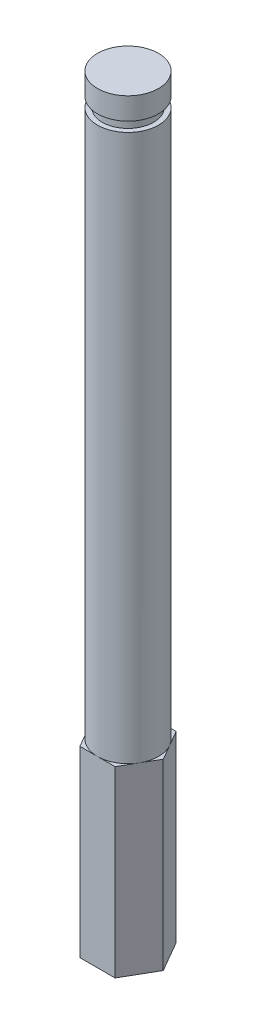
ISO-10303-21;
HEADER;
FILE_DESCRIPTION(('STEP AP214'),'2;1');
FILE_NAME('part.step','',(''),(''),'','','');
FILE_SCHEMA(('AUTOMOTIVE_DESIGN { 1 0 10303 214 1 1 1 1 }'));
ENDSEC;
DATA;
#1=APPLICATION_CONTEXT('core data for automotive mechanical design processes');
#2=APPLICATION_PROTOCOL_DEFINITION('international standard','automotive_design',2000,#1);
#3=PRODUCT_CONTEXT('',#1,'mechanical');
#4=PRODUCT('Part','Part','',(#3));
#5=PRODUCT_RELATED_PRODUCT_CATEGORY('part','',(#4));
#6=PRODUCT_DEFINITION_FORMATION('','',#4);
#7=PRODUCT_DEFINITION_CONTEXT('part definition',#1,'design');
#8=PRODUCT_DEFINITION('design','',#6,#7);
#9=PRODUCT_DEFINITION_SHAPE('','',#8);
#10=(LENGTH_UNIT() NAMED_UNIT(*) SI_UNIT(.MILLI.,.METRE.));
#11=(NAMED_UNIT(*) PLANE_ANGLE_UNIT() SI_UNIT($,.RADIAN.));
#12=(NAMED_UNIT(*) SI_UNIT($,.STERADIAN.) SOLID_ANGLE_UNIT());
#13=UNCERTAINTY_MEASURE_WITH_UNIT(LENGTH_MEASURE(1.E-05),#10,'distance_accuracy_value','');
#14=(GEOMETRIC_REPRESENTATION_CONTEXT(3) GLOBAL_UNCERTAINTY_ASSIGNED_CONTEXT((#13)) GLOBAL_UNIT_ASSIGNED_CONTEXT((#10,
#11,#12)) REPRESENTATION_CONTEXT('',''));
#15=CARTESIAN_POINT('',(0.,0.,0.));
#16=DIRECTION('',(0.,0.,1.));
#17=DIRECTION('',(1.,0.,0.));
#18=AXIS2_PLACEMENT_3D('',#15,#16,#17);
#19=CARTESIAN_POINT('',(0.,19.05,0.));
#20=DIRECTION('',(0.,1.,0.));
#21=DIRECTION('',(0.,0.,1.));
#22=AXIS2_PLACEMENT_3D('',#19,#20,#21);
#23=PLANE('',#22);
#24=CARTESIAN_POINT('',(0.,19.05,0.));
#25=DIRECTION('',(0.,1.,0.));
#26=DIRECTION('',(0.,0.,1.));
#27=AXIS2_PLACEMENT_3D('',#24,#25,#26);
#28=CIRCLE('',#27,3.175);
#29=CARTESIAN_POINT('',(0.,19.05,3.175));
#30=VERTEX_POINT('',#29);
#31=CARTESIAN_POINT('',(2.74963065701559,19.05,1.5875));
#32=VERTEX_POINT('',#31);
#33=EDGE_CURVE('E134',#30,#32,#28,.T.);
#34=ORIENTED_EDGE('',*,*,#33,.F.);
#35=DIRECTION('',(1.,0.,0.));
#36=VECTOR('',#35,1.);
#37=CARTESIAN_POINT('',(-1.83308710467706,19.05,3.175));
#38=LINE('',#37,#36);
#39=CARTESIAN_POINT('',(1.83308710467706,19.05,3.175));
#40=VERTEX_POINT('',#39);
#41=EDGE_CURVE('E122',#30,#40,#38,.T.);
#42=ORIENTED_EDGE('',*,*,#41,.T.);
#43=DIRECTION('',(0.5,0.,-0.866025403784438));
#44=VECTOR('',#43,1.);
#45=CARTESIAN_POINT('',(1.83308710467706,19.05,3.175));
#46=LINE('',#45,#44);
#47=EDGE_CURVE('E135',#40,#32,#46,.T.);
#48=ORIENTED_EDGE('',*,*,#47,.T.);
#49=EDGE_LOOP('',(#34,#42,#48));
#50=FACE_BOUND('',#49,.T.);
#51=ADVANCED_FACE('F43',(#50),#23,.T.);
#52=CARTESIAN_POINT('',(2.74963065701559,19.05,-1.5875));
#53=VERTEX_POINT('',#52);
#54=EDGE_CURVE('E52',#32,#53,#28,.T.);
#55=ORIENTED_EDGE('',*,*,#54,.F.);
#56=CARTESIAN_POINT('',(3.66617420935412,19.05,0.));
#57=VERTEX_POINT('',#56);
#58=EDGE_CURVE('E121',#32,#57,#46,.T.);
#59=ORIENTED_EDGE('',*,*,#58,.T.);
#60=DIRECTION('',(-0.5,0.,-0.866025403784438));
#61=VECTOR('',#60,1.);
#62=CARTESIAN_POINT('',(3.66617420935412,19.05,0.));
#63=LINE('',#62,#61);
#64=EDGE_CURVE('E149',#57,#53,#63,.T.);
#65=ORIENTED_EDGE('',*,*,#64,.T.);
#66=EDGE_LOOP('',(#55,#59,#65));
#67=FACE_BOUND('',#66,.T.);
#68=ADVANCED_FACE('F210',(#67),#23,.T.);
#69=CARTESIAN_POINT('',(0.,19.05,-3.175));
#70=VERTEX_POINT('',#69);
#71=EDGE_CURVE('E212',#53,#70,#28,.T.);
#72=ORIENTED_EDGE('',*,*,#71,.F.);
#73=CARTESIAN_POINT('',(1.83308710467706,19.05,-3.175));
#74=VERTEX_POINT('',#73);
#75=EDGE_CURVE('E152',#53,#74,#63,.T.);
#76=ORIENTED_EDGE('',*,*,#75,.T.);
#77=DIRECTION('',(-1.,0.,0.));
#78=VECTOR('',#77,1.);
#79=CARTESIAN_POINT('',(1.83308710467706,19.05,-3.175));
#80=LINE('',#79,#78);
#81=EDGE_CURVE('E153',#74,#70,#80,.T.);
#82=ORIENTED_EDGE('',*,*,#81,.T.);
#83=EDGE_LOOP('',(#72,#76,#82));
#84=FACE_BOUND('',#83,.T.);
#85=ADVANCED_FACE('F218',(#84),#23,.T.);
#86=CARTESIAN_POINT('',(-2.74963065701559,19.05,-1.5875));
#87=VERTEX_POINT('',#86);
#88=EDGE_CURVE('E144',#70,#87,#28,.T.);
#89=ORIENTED_EDGE('',*,*,#88,.F.);
#90=CARTESIAN_POINT('',(-1.83308710467706,19.05,-3.175));
#91=VERTEX_POINT('',#90);
#92=EDGE_CURVE('E151',#70,#91,#80,.T.);
#93=ORIENTED_EDGE('',*,*,#92,.T.);
#94=DIRECTION('',(-0.5,0.,0.866025403784438));
#95=VECTOR('',#94,1.);
#96=CARTESIAN_POINT('',(-1.83308710467706,19.05,-3.175));
#97=LINE('',#96,#95);
#98=EDGE_CURVE('E157',#91,#87,#97,.T.);
#99=ORIENTED_EDGE('',*,*,#98,.T.);
#100=EDGE_LOOP('',(#89,#93,#99));
#101=FACE_BOUND('',#100,.T.);
#102=ADVANCED_FACE('F214',(#101),#23,.T.);
#103=CARTESIAN_POINT('',(-2.74963065701559,19.05,1.5875));
#104=VERTEX_POINT('',#103);
#105=EDGE_CURVE('E143',#87,#104,#28,.T.);
#106=ORIENTED_EDGE('',*,*,#105,.F.);
#107=CARTESIAN_POINT('',(-3.66617420935413,19.05,0.));
#108=VERTEX_POINT('',#107);
#109=EDGE_CURVE('E156',#87,#108,#97,.T.);
#110=ORIENTED_EDGE('',*,*,#109,.T.);
#111=DIRECTION('',(0.5,0.,0.866025403784438));
#112=VECTOR('',#111,1.);
#113=CARTESIAN_POINT('',(-3.66617420935413,19.05,0.));
#114=LINE('',#113,#112);
#115=EDGE_CURVE('E132',#108,#104,#114,.T.);
#116=ORIENTED_EDGE('',*,*,#115,.T.);
#117=EDGE_LOOP('',(#106,#110,#116));
#118=FACE_BOUND('',#117,.T.);
#119=ADVANCED_FACE('F225',(#118),#23,.T.);
#120=CARTESIAN_POINT('',(3.66617420935412,19.05,0.));
#121=DIRECTION('',(-0.866025403784439,0.,0.5));
#122=DIRECTION('',(0.5,0.,0.866025403784438));
#123=AXIS2_PLACEMENT_3D('',#120,#121,#122);
#124=PLANE('',#123);
#125=DIRECTION('',(-0.5,0.,-0.866025403784438));
#126=VECTOR('',#125,1.);
#127=CARTESIAN_POINT('',(3.66617420935412,0.,0.));
#128=LINE('',#127,#126);
#129=CARTESIAN_POINT('',(3.66617420935412,0.,0.));
#130=VERTEX_POINT('',#129);
#131=CARTESIAN_POINT('',(1.83308710467706,0.,-3.175));
#132=VERTEX_POINT('',#131);
#133=EDGE_CURVE('E164',#130,#132,#128,.T.);
#134=ORIENTED_EDGE('',*,*,#133,.T.);
#135=DIRECTION('',(0.,-1.,0.));
#136=VECTOR('',#135,1.);
#137=CARTESIAN_POINT('',(1.83308710467706,19.05,-3.175));
#138=LINE('',#137,#136);
#139=EDGE_CURVE('E47',#74,#132,#138,.T.);
#140=ORIENTED_EDGE('',*,*,#139,.F.);
#141=ORIENTED_EDGE('',*,*,#75,.F.);
#142=ORIENTED_EDGE('',*,*,#64,.F.);
#143=DIRECTION('',(0.,-1.,0.));
#144=VECTOR('',#143,1.);
#145=CARTESIAN_POINT('',(3.66617420935412,19.05,0.));
#146=LINE('',#145,#144);
#147=EDGE_CURVE('E163',#57,#130,#146,.T.);
#148=ORIENTED_EDGE('',*,*,#147,.T.);
#149=EDGE_LOOP('',(#134,#140,#141,#142,#148));
#150=FACE_BOUND('',#149,.T.);
#151=ADVANCED_FACE('F45',(#150),#124,.F.);
#152=CARTESIAN_POINT('',(1.83308710467706,19.05,-3.175));
#153=DIRECTION('',(0.,0.,1.));
#154=DIRECTION('',(1.,0.,0.));
#155=AXIS2_PLACEMENT_3D('',#152,#153,#154);
#156=PLANE('',#155);
#157=DIRECTION('',(-1.,0.,0.));
#158=VECTOR('',#157,1.);
#159=CARTESIAN_POINT('',(1.83308710467706,0.,-3.175));
#160=LINE('',#159,#158);
#161=CARTESIAN_POINT('',(-1.83308710467706,0.,-3.175));
#162=VERTEX_POINT('',#161);
#163=EDGE_CURVE('E167',#132,#162,#160,.T.);
#164=ORIENTED_EDGE('',*,*,#163,.T.);
#165=DIRECTION('',(0.,-1.,0.));
#166=VECTOR('',#165,1.);
#167=CARTESIAN_POINT('',(-1.83308710467706,19.05,-3.175));
#168=LINE('',#167,#166);
#169=EDGE_CURVE('E146',#91,#162,#168,.T.);
#170=ORIENTED_EDGE('',*,*,#169,.F.);
#171=ORIENTED_EDGE('',*,*,#92,.F.);
#172=ORIENTED_EDGE('',*,*,#81,.F.);
#173=ORIENTED_EDGE('',*,*,#139,.T.);
#174=EDGE_LOOP('',(#164,#170,#171,#172,#173));
#175=FACE_BOUND('',#174,.T.);
#176=ADVANCED_FACE('F216',(#175),#156,.F.);
#177=CARTESIAN_POINT('',(-1.83308710467706,19.05,-3.175));
#178=DIRECTION('',(0.866025403784439,0.,0.5));
#179=DIRECTION('',(0.5,0.,-0.866025403784438));
#180=AXIS2_PLACEMENT_3D('',#177,#178,#179);
#181=PLANE('',#180);
#182=DIRECTION('',(-0.5,0.,0.866025403784438));
#183=VECTOR('',#182,1.);
#184=CARTESIAN_POINT('',(-1.83308710467706,0.,-3.175));
#185=LINE('',#184,#183);
#186=CARTESIAN_POINT('',(-3.66617420935413,0.,0.));
#187=VERTEX_POINT('',#186);
#188=EDGE_CURVE('E169',#162,#187,#185,.T.);
#189=ORIENTED_EDGE('',*,*,#188,.T.);
#190=DIRECTION('',(0.,-1.,0.));
#191=VECTOR('',#190,1.);
#192=CARTESIAN_POINT('',(-3.66617420935413,19.05,0.));
#193=LINE('',#192,#191);
#194=EDGE_CURVE('E182',#108,#187,#193,.T.);
#195=ORIENTED_EDGE('',*,*,#194,.F.);
#196=ORIENTED_EDGE('',*,*,#109,.F.);
#197=ORIENTED_EDGE('',*,*,#98,.F.);
#198=ORIENTED_EDGE('',*,*,#169,.T.);
#199=EDGE_LOOP('',(#189,#195,#196,#197,#198));
#200=FACE_BOUND('',#199,.T.);
#201=ADVANCED_FACE('F189',(#200),#181,.F.);
#202=CARTESIAN_POINT('',(-3.66617420935413,19.05,0.));
#203=DIRECTION('',(0.866025403784439,0.,-0.5));
#204=DIRECTION('',(-0.5,0.,-0.866025403784438));
#205=AXIS2_PLACEMENT_3D('',#202,#203,#204);
#206=PLANE('',#205);
#207=DIRECTION('',(0.5,0.,0.866025403784438));
#208=VECTOR('',#207,1.);
#209=CARTESIAN_POINT('',(-3.66617420935413,0.,0.));
#210=LINE('',#209,#208);
#211=CARTESIAN_POINT('',(-1.83308710467706,0.,3.175));
#212=VERTEX_POINT('',#211);
#213=EDGE_CURVE('E171',#187,#212,#210,.T.);
#214=ORIENTED_EDGE('',*,*,#213,.T.);
#215=DIRECTION('',(0.,-1.,0.));
#216=VECTOR('',#215,1.);
#217=CARTESIAN_POINT('',(-1.83308710467706,19.05,3.175));
#218=LINE('',#217,#216);
#219=CARTESIAN_POINT('',(-1.83308710467706,19.05,3.175));
#220=VERTEX_POINT('',#219);
#221=EDGE_CURVE('E180',#220,#212,#218,.T.);
#222=ORIENTED_EDGE('',*,*,#221,.F.);
#223=EDGE_CURVE('E117',#104,#220,#114,.T.);
#224=ORIENTED_EDGE('',*,*,#223,.F.);
#225=ORIENTED_EDGE('',*,*,#115,.F.);
#226=ORIENTED_EDGE('',*,*,#194,.T.);
#227=EDGE_LOOP('',(#214,#222,#224,#225,#226));
#228=FACE_BOUND('',#227,.T.);
#229=ADVANCED_FACE('F201',(#228),#206,.F.);
#230=CARTESIAN_POINT('',(-1.83308710467706,19.05,3.175));
#231=DIRECTION('',(0.,0.,-1.));
#232=DIRECTION('',(-1.,0.,0.));
#233=AXIS2_PLACEMENT_3D('',#230,#231,#232);
#234=PLANE('',#233);
#235=DIRECTION('',(1.,0.,0.));
#236=VECTOR('',#235,1.);
#237=CARTESIAN_POINT('',(-1.83308710467706,0.,3.175));
#238=LINE('',#237,#236);
#239=CARTESIAN_POINT('',(1.83308710467706,0.,3.175));
#240=VERTEX_POINT('',#239);
#241=EDGE_CURVE('E173',#212,#240,#238,.T.);
#242=ORIENTED_EDGE('',*,*,#241,.T.);
#243=DIRECTION('',(0.,-1.,0.));
#244=VECTOR('',#243,1.);
#245=CARTESIAN_POINT('',(1.83308710467706,19.05,3.175));
#246=LINE('',#245,#244);
#247=EDGE_CURVE('E128',#40,#240,#246,.T.);
#248=ORIENTED_EDGE('',*,*,#247,.F.);
#249=ORIENTED_EDGE('',*,*,#41,.F.);
#250=EDGE_CURVE('E114',#220,#30,#38,.T.);
#251=ORIENTED_EDGE('',*,*,#250,.F.);
#252=ORIENTED_EDGE('',*,*,#221,.T.);
#253=EDGE_LOOP('',(#242,#248,#249,#251,#252));
#254=FACE_BOUND('',#253,.T.);
#255=ADVANCED_FACE('F126',(#254),#234,.F.);
#256=CARTESIAN_POINT('',(1.83308710467706,19.05,3.175));
#257=DIRECTION('',(-0.866025403784439,0.,-0.5));
#258=DIRECTION('',(-0.5,0.,0.866025403784439));
#259=AXIS2_PLACEMENT_3D('',#256,#257,#258);
#260=PLANE('',#259);
#261=DIRECTION('',(0.5,0.,-0.866025403784438));
#262=VECTOR('',#261,1.);
#263=CARTESIAN_POINT('',(1.83308710467706,0.,3.175));
#264=LINE('',#263,#262);
#265=EDGE_CURVE('E175',#240,#130,#264,.T.);
#266=ORIENTED_EDGE('',*,*,#265,.T.);
#267=ORIENTED_EDGE('',*,*,#147,.F.);
#268=ORIENTED_EDGE('',*,*,#58,.F.);
#269=ORIENTED_EDGE('',*,*,#47,.F.);
#270=ORIENTED_EDGE('',*,*,#247,.T.);
#271=EDGE_LOOP('',(#266,#267,#268,#269,#270));
#272=FACE_BOUND('',#271,.T.);
#273=ADVANCED_FACE('F204',(#272),#260,.F.);
#274=EDGE_CURVE('E67',#104,#30,#28,.T.);
#275=ORIENTED_EDGE('',*,*,#274,.F.);
#276=ORIENTED_EDGE('',*,*,#223,.T.);
#277=ORIENTED_EDGE('',*,*,#250,.T.);
#278=EDGE_LOOP('',(#275,#276,#277));
#279=FACE_BOUND('',#278,.T.);
#280=ADVANCED_FACE('F116',(#279),#23,.T.);
#281=CARTESIAN_POINT('',(0.,0.,0.));
#282=DIRECTION('',(0.,1.,0.));
#283=DIRECTION('',(0.,0.,1.));
#284=AXIS2_PLACEMENT_3D('',#281,#282,#283);
#285=PLANE('',#284);
#286=ORIENTED_EDGE('',*,*,#133,.F.);
#287=ORIENTED_EDGE('',*,*,#265,.F.);
#288=ORIENTED_EDGE('',*,*,#241,.F.);
#289=ORIENTED_EDGE('',*,*,#213,.F.);
#290=ORIENTED_EDGE('',*,*,#188,.F.);
#291=ORIENTED_EDGE('',*,*,#163,.F.);
#292=EDGE_LOOP('',(#286,#287,#288,#289,#290,#291));
#293=FACE_BOUND('',#292,.T.);
#294=ADVANCED_FACE('F197',(#293),#285,.F.);
#295=CARTESIAN_POINT('',(0.,75.946,0.));
#296=DIRECTION('',(0.,-1.,0.));
#297=DIRECTION('',(0.,0.,-1.));
#298=AXIS2_PLACEMENT_3D('',#295,#296,#297);
#299=CYLINDRICAL_SURFACE('',#298,3.175);
#300=CARTESIAN_POINT('',(0.,75.946,0.));
#301=DIRECTION('',(0.,1.,0.));
#302=DIRECTION('',(0.,0.,1.));
#303=AXIS2_PLACEMENT_3D('',#300,#301,#302);
#304=CIRCLE('',#303,3.175);
#305=CARTESIAN_POINT('',(0.,75.946,3.175));
#306=VERTEX_POINT('',#305);
#307=EDGE_CURVE('E137',#306,#306,#304,.T.);
#308=ORIENTED_EDGE('',*,*,#307,.F.);
#309=EDGE_LOOP('',(#308));
#310=FACE_BOUND('',#309,.T.);
#311=ORIENTED_EDGE('',*,*,#33,.T.);
#312=ORIENTED_EDGE('',*,*,#54,.T.);
#313=ORIENTED_EDGE('',*,*,#71,.T.);
#314=ORIENTED_EDGE('',*,*,#88,.T.);
#315=ORIENTED_EDGE('',*,*,#105,.T.);
#316=ORIENTED_EDGE('',*,*,#274,.T.);
#317=EDGE_LOOP('',(#311,#312,#313,#314,#315,#316));
#318=FACE_BOUND('',#317,.T.);
#319=ADVANCED_FACE('F141',(#310,#318),#299,.T.);
#320=CARTESIAN_POINT('',(0.,75.946,0.));
#321=DIRECTION('',(0.,1.,0.));
#322=DIRECTION('',(0.,0.,1.));
#323=AXIS2_PLACEMENT_3D('',#320,#321,#322);
#324=PLANE('',#323);
#325=CARTESIAN_POINT('',(0.,75.946,0.));
#326=DIRECTION('',(0.,1.,0.));
#327=DIRECTION('',(0.,0.,1.));
#328=AXIS2_PLACEMENT_3D('',#325,#326,#327);
#329=CIRCLE('',#328,2.667);
#330=CARTESIAN_POINT('',(0.,75.946,2.667));
#331=VERTEX_POINT('',#330);
#332=EDGE_CURVE('E11',#331,#331,#329,.T.);
#333=ORIENTED_EDGE('',*,*,#332,.F.);
#334=EDGE_LOOP('',(#333));
#335=FACE_BOUND('',#334,.T.);
#336=ORIENTED_EDGE('',*,*,#307,.T.);
#337=EDGE_LOOP('',(#336));
#338=FACE_BOUND('',#337,.T.);
#339=ADVANCED_FACE('F306',(#335,#338),#324,.T.);
#340=CARTESIAN_POINT('',(0.,76.962,0.));
#341=DIRECTION('',(0.,-1.,0.));
#342=DIRECTION('',(0.,0.,-1.));
#343=AXIS2_PLACEMENT_3D('',#340,#341,#342);
#344=CYLINDRICAL_SURFACE('',#343,2.667);
#345=CARTESIAN_POINT('',(0.,76.962,0.));
#346=DIRECTION('',(0.,1.,0.));
#347=DIRECTION('',(0.,0.,1.));
#348=AXIS2_PLACEMENT_3D('',#345,#346,#347);
#349=CIRCLE('',#348,2.667);
#350=CARTESIAN_POINT('',(0.,76.962,2.667));
#351=VERTEX_POINT('',#350);
#352=EDGE_CURVE('E138',#351,#351,#349,.T.);
#353=ORIENTED_EDGE('',*,*,#352,.F.);
#354=EDGE_LOOP('',(#353));
#355=FACE_BOUND('',#354,.T.);
#356=ORIENTED_EDGE('',*,*,#332,.T.);
#357=EDGE_LOOP('',(#356));
#358=FACE_BOUND('',#357,.T.);
#359=ADVANCED_FACE('F315',(#355,#358),#344,.T.);
#360=CARTESIAN_POINT('',(0.,79.248,0.));
#361=DIRECTION('',(0.,-1.,0.));
#362=DIRECTION('',(0.,0.,-1.));
#363=AXIS2_PLACEMENT_3D('',#360,#361,#362);
#364=CYLINDRICAL_SURFACE('',#363,3.175);
#365=CARTESIAN_POINT('',(0.,79.248,0.));
#366=DIRECTION('',(0.,1.,0.));
#367=DIRECTION('',(0.,0.,1.));
#368=AXIS2_PLACEMENT_3D('',#365,#366,#367);
#369=CIRCLE('',#368,3.175);
#370=CARTESIAN_POINT('',(0.,79.248,3.175));
#371=VERTEX_POINT('',#370);
#372=EDGE_CURVE('E365',#371,#371,#369,.T.);
#373=ORIENTED_EDGE('',*,*,#372,.F.);
#374=EDGE_LOOP('',(#373));
#375=FACE_BOUND('',#374,.T.);
#376=CARTESIAN_POINT('',(0.,76.962,0.));
#377=DIRECTION('',(0.,1.,0.));
#378=DIRECTION('',(0.,0.,1.));
#379=AXIS2_PLACEMENT_3D('',#376,#377,#378);
#380=CIRCLE('',#379,3.175);
#381=CARTESIAN_POINT('',(0.,76.962,3.175));
#382=VERTEX_POINT('',#381);
#383=EDGE_CURVE('E363',#382,#382,#380,.T.);
#384=ORIENTED_EDGE('',*,*,#383,.T.);
#385=EDGE_LOOP('',(#384));
#386=FACE_BOUND('',#385,.T.);
#387=ADVANCED_FACE('F325',(#375,#386),#364,.T.);
#388=CARTESIAN_POINT('',(0.,79.248,0.));
#389=DIRECTION('',(0.,1.,0.));
#390=DIRECTION('',(0.,0.,1.));
#391=AXIS2_PLACEMENT_3D('',#388,#389,#390);
#392=PLANE('',#391);
#393=ORIENTED_EDGE('',*,*,#372,.T.);
#394=EDGE_LOOP('',(#393));
#395=FACE_BOUND('',#394,.T.);
#396=ADVANCED_FACE('F335',(#395),#392,.T.);
#397=CARTESIAN_POINT('',(0.,76.962,0.));
#398=DIRECTION('',(0.,1.,0.));
#399=DIRECTION('',(0.,0.,1.));
#400=AXIS2_PLACEMENT_3D('',#397,#398,#399);
#401=PLANE('',#400);
#402=ORIENTED_EDGE('',*,*,#352,.T.);
#403=EDGE_LOOP('',(#402));
#404=FACE_BOUND('',#403,.T.);
#405=ORIENTED_EDGE('',*,*,#383,.F.);
#406=EDGE_LOOP('',(#405));
#407=FACE_BOUND('',#406,.T.);
#408=ADVANCED_FACE('F345',(#404,#407),#401,.F.);
#409=CLOSED_SHELL('',(#51,#68,#85,#102,#119,#151,#176,#201,#229,#255,#273,#280,#294,#319,#339,
#359,#387,#396,#408));
#410=MANIFOLD_SOLID_BREP('B2',#409);
#411=ADVANCED_BREP_SHAPE_REPRESENTATION('',(#18,#410),#14);
#412=SHAPE_DEFINITION_REPRESENTATION(#9,#411);
ENDSEC;
END-ISO-10303-21;
